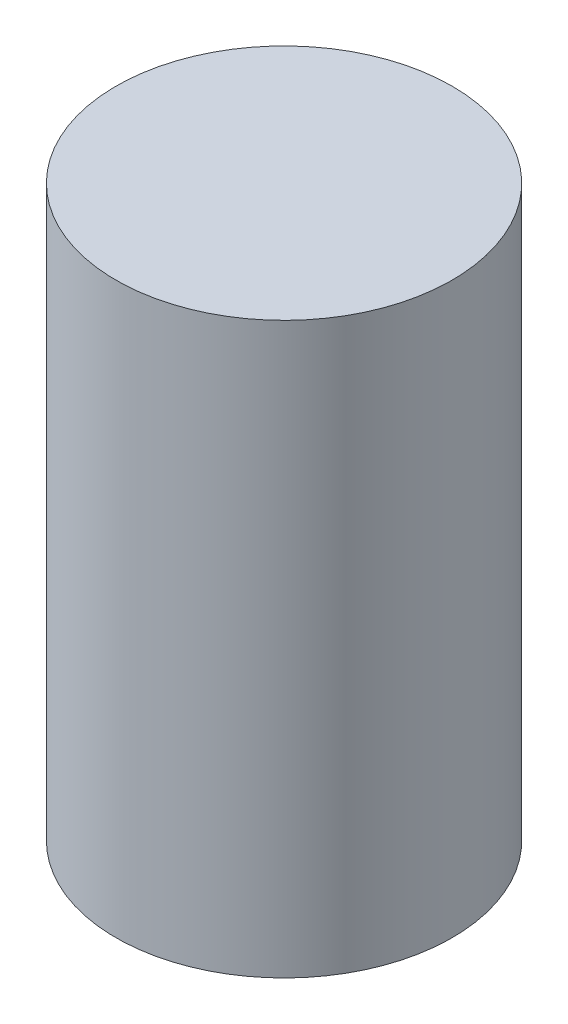
ISO-10303-21;
HEADER;
FILE_DESCRIPTION(('STEP AP214'),'2;1');
FILE_NAME('part.step','',(''),(''),'','','');
FILE_SCHEMA(('AUTOMOTIVE_DESIGN { 1 0 10303 214 1 1 1 1 }'));
ENDSEC;
DATA;
#1=APPLICATION_CONTEXT('core data for automotive mechanical design processes');
#2=APPLICATION_PROTOCOL_DEFINITION('international standard','automotive_design',2000,#1);
#3=PRODUCT_CONTEXT('',#1,'mechanical');
#4=PRODUCT('Part','Part','',(#3));
#5=PRODUCT_RELATED_PRODUCT_CATEGORY('part','',(#4));
#6=PRODUCT_DEFINITION_FORMATION('','',#4);
#7=PRODUCT_DEFINITION_CONTEXT('part definition',#1,'design');
#8=PRODUCT_DEFINITION('design','',#6,#7);
#9=PRODUCT_DEFINITION_SHAPE('','',#8);
#10=(LENGTH_UNIT() NAMED_UNIT(*) SI_UNIT(.MILLI.,.METRE.));
#11=(NAMED_UNIT(*) PLANE_ANGLE_UNIT() SI_UNIT($,.RADIAN.));
#12=(NAMED_UNIT(*) SI_UNIT($,.STERADIAN.) SOLID_ANGLE_UNIT());
#13=UNCERTAINTY_MEASURE_WITH_UNIT(LENGTH_MEASURE(1.E-05),#10,'distance_accuracy_value','');
#14=(GEOMETRIC_REPRESENTATION_CONTEXT(3) GLOBAL_UNCERTAINTY_ASSIGNED_CONTEXT((#13)) GLOBAL_UNIT_ASSIGNED_CONTEXT((#10,
#11,#12)) REPRESENTATION_CONTEXT('',''));
#15=CARTESIAN_POINT('',(0.,0.,0.));
#16=DIRECTION('',(0.,0.,1.));
#17=DIRECTION('',(1.,0.,0.));
#18=AXIS2_PLACEMENT_3D('',#15,#16,#17);
#19=CARTESIAN_POINT('',(0.,0.,0.));
#20=DIRECTION('',(0.,1.,0.));
#21=DIRECTION('',(0.,0.,1.));
#22=AXIS2_PLACEMENT_3D('',#19,#20,#21);
#23=PLANE('',#22);
#24=CARTESIAN_POINT('',(0.,0.,0.));
#25=DIRECTION('',(0.,1.,0.));
#26=DIRECTION('',(0.,0.,1.));
#27=AXIS2_PLACEMENT_3D('',#24,#25,#26);
#28=CIRCLE('',#27,540.);
#29=CARTESIAN_POINT('',(0.,-2.22044604925031E-13,-540.));
#30=VERTEX_POINT('',#29);
#31=EDGE_CURVE('E44',#30,#30,#28,.T.);
#32=ORIENTED_EDGE('',*,*,#31,.F.);
#33=EDGE_LOOP('',(#32));
#34=FACE_BOUND('',#33,.T.);
#35=CARTESIAN_POINT('',(0.,0.,0.));
#36=DIRECTION('',(0.,1.,0.));
#37=DIRECTION('',(0.,0.,1.));
#38=AXIS2_PLACEMENT_3D('',#35,#36,#37);
#39=CIRCLE('',#38,21.15);
#40=CARTESIAN_POINT('',(0.,0.,21.15));
#41=VERTEX_POINT('',#40);
#42=EDGE_CURVE('E10',#41,#41,#39,.F.);
#43=ORIENTED_EDGE('',*,*,#42,.F.);
#44=EDGE_LOOP('',(#43));
#45=FACE_BOUND('',#44,.T.);
#46=ADVANCED_FACE('F33',(#34,#45),#23,.F.);
#47=CARTESIAN_POINT('',(0.,1830.,0.));
#48=DIRECTION('',(0.,-1.,0.));
#49=DIRECTION('',(0.,0.,-1.));
#50=AXIS2_PLACEMENT_3D('',#47,#48,#49);
#51=CYLINDRICAL_SURFACE('',#50,540.);
#52=CARTESIAN_POINT('',(0.,1830.,0.));
#53=DIRECTION('',(0.,1.,0.));
#54=DIRECTION('',(0.,0.,1.));
#55=AXIS2_PLACEMENT_3D('',#52,#53,#54);
#56=CIRCLE('',#55,540.);
#57=CARTESIAN_POINT('',(0.,1830.,-540.));
#58=VERTEX_POINT('',#57);
#59=EDGE_CURVE('E40',#58,#58,#56,.T.);
#60=CARTESIAN_POINT('',(0.,1830.,-540.));
#61=CARTESIAN_POINT('',(0.,1810.9375,-540.));
#62=CARTESIAN_POINT('',(0.,1791.875,-540.));
#63=CARTESIAN_POINT('',(0.,1753.75,-540.));
#64=CARTESIAN_POINT('',(0.,1734.6875,-540.));
#65=CARTESIAN_POINT('',(0.,1696.5625,-540.));
#66=CARTESIAN_POINT('',(0.,1677.5,-540.));
#67=CARTESIAN_POINT('',(0.,1639.375,-540.));
#68=CARTESIAN_POINT('',(0.,1620.3125,-540.));
#69=CARTESIAN_POINT('',(0.,1582.1875,-540.));
#70=CARTESIAN_POINT('',(0.,1563.125,-540.));
#71=CARTESIAN_POINT('',(0.,1525.,-540.));
#72=CARTESIAN_POINT('',(0.,1505.9375,-540.));
#73=CARTESIAN_POINT('',(0.,1467.8125,-540.));
#74=CARTESIAN_POINT('',(0.,1448.75,-540.));
#75=CARTESIAN_POINT('',(0.,1410.625,-540.));
#76=CARTESIAN_POINT('',(0.,1391.5625,-540.));
#77=CARTESIAN_POINT('',(0.,1353.4375,-540.));
#78=CARTESIAN_POINT('',(0.,1334.375,-540.));
#79=CARTESIAN_POINT('',(0.,1296.25,-540.));
#80=CARTESIAN_POINT('',(0.,1277.1875,-540.));
#81=CARTESIAN_POINT('',(0.,1239.0625,-540.));
#82=CARTESIAN_POINT('',(0.,1220.,-540.));
#83=CARTESIAN_POINT('',(0.,1181.875,-540.));
#84=CARTESIAN_POINT('',(0.,1162.8125,-540.));
#85=CARTESIAN_POINT('',(0.,1124.6875,-540.));
#86=CARTESIAN_POINT('',(0.,1105.625,-540.));
#87=CARTESIAN_POINT('',(0.,1067.5,-540.));
#88=CARTESIAN_POINT('',(0.,1048.4375,-540.));
#89=CARTESIAN_POINT('',(0.,1010.3125,-540.));
#90=CARTESIAN_POINT('',(0.,991.25,-540.));
#91=CARTESIAN_POINT('',(0.,953.125,-540.));
#92=CARTESIAN_POINT('',(0.,934.0625,-540.));
#93=CARTESIAN_POINT('',(0.,895.9375,-540.));
#94=CARTESIAN_POINT('',(0.,876.875,-540.));
#95=CARTESIAN_POINT('',(0.,838.75,-540.));
#96=CARTESIAN_POINT('',(0.,819.6875,-540.));
#97=CARTESIAN_POINT('',(0.,781.5625,-540.));
#98=CARTESIAN_POINT('',(0.,762.5,-540.));
#99=CARTESIAN_POINT('',(0.,724.375,-540.));
#100=CARTESIAN_POINT('',(0.,705.3125,-540.));
#101=CARTESIAN_POINT('',(0.,667.1875,-540.));
#102=CARTESIAN_POINT('',(0.,648.125,-540.));
#103=CARTESIAN_POINT('',(0.,610.,-540.));
#104=CARTESIAN_POINT('',(0.,590.9375,-540.));
#105=CARTESIAN_POINT('',(0.,552.8125,-540.));
#106=CARTESIAN_POINT('',(0.,533.75,-540.));
#107=CARTESIAN_POINT('',(0.,495.625,-540.));
#108=CARTESIAN_POINT('',(0.,476.5625,-540.));
#109=CARTESIAN_POINT('',(0.,438.4375,-540.));
#110=CARTESIAN_POINT('',(0.,419.375,-540.));
#111=CARTESIAN_POINT('',(0.,381.25,-540.));
#112=CARTESIAN_POINT('',(0.,362.1875,-540.));
#113=CARTESIAN_POINT('',(0.,324.0625,-540.));
#114=CARTESIAN_POINT('',(0.,305.,-540.));
#115=CARTESIAN_POINT('',(0.,266.875,-540.));
#116=CARTESIAN_POINT('',(0.,247.8125,-540.));
#117=CARTESIAN_POINT('',(0.,209.6875,-540.));
#118=CARTESIAN_POINT('',(0.,190.625,-540.));
#119=CARTESIAN_POINT('',(0.,152.5,-540.));
#120=CARTESIAN_POINT('',(0.,133.4375,-540.));
#121=CARTESIAN_POINT('',(0.,95.3124999999998,-540.));
#122=CARTESIAN_POINT('',(0.,76.2499999999998,-540.));
#123=CARTESIAN_POINT('',(0.,38.1249999999997,-540.));
#124=CARTESIAN_POINT('',(0.,19.0624999999997,-540.));
#125=CARTESIAN_POINT('',(0.,-2.22044604925031E-13,-540.));
#126=B_SPLINE_CURVE_WITH_KNOTS('',3,(#60,#61,#62,#63,#64,#65,#66,#67,#68,#69,#70,#71,#72,#73,
#74,#75,#76,#77,#78,#79,#80,#81,#82,#83,#84,#85,#86,#87,#88,#89,#90,#91,#92,#93,#94,#95,#96,#97,
#98,#99,#100,#101,#102,#103,#104,#105,#106,#107,#108,#109,#110,#111,#112,#113,#114,#115,#116,
#117,#118,#119,#120,#121,#122,#123,#124,#125),.UNSPECIFIED.,.F.,.F.,(4,2,2,2,2,2,2,2,2,2,2,2,2,
2,2,2,2,2,2,2,2,2,2,2,2,2,2,2,2,2,2,2,4),(0.,57.1874999999999,114.375,171.5625,228.75,285.9375,
343.125,400.3125,457.5,514.6875,571.875,629.0625,686.25,743.4375,800.625,857.8125,915.,972.1875,
1029.375,1086.5625,1143.75,1200.9375,1258.125,1315.3125,1372.5,1429.6875,1486.875,1544.0625,
1601.25,1658.4375,1715.625,1772.8125,1830.),.UNSPECIFIED.);
#127=EDGE_CURVE('BSEAM35',#58,#30,#126,.T.);
#128=ORIENTED_EDGE('',*,*,#59,.F.);
#129=ORIENTED_EDGE('',*,*,#31,.T.);
#130=ORIENTED_EDGE('',*,*,#127,.T.);
#131=ORIENTED_EDGE('',*,*,#127,.F.);
#132=EDGE_LOOP('',(#128,#130,#129,#131));
#133=FACE_BOUND('',#132,.T.);
#134=ADVANCED_FACE('F35',(#133),#51,.T.);
#135=CARTESIAN_POINT('',(0.,1830.,0.));
#136=DIRECTION('',(0.,1.,0.));
#137=DIRECTION('',(0.,0.,1.));
#138=AXIS2_PLACEMENT_3D('',#135,#136,#137);
#139=PLANE('',#138);
#140=ORIENTED_EDGE('',*,*,#59,.T.);
#141=EDGE_LOOP('',(#140));
#142=FACE_BOUND('',#141,.T.);
#143=ADVANCED_FACE('F58',(#142),#139,.T.);
#144=CARTESIAN_POINT('',(0.,-30.,0.));
#145=DIRECTION('',(0.,1.,0.));
#146=DIRECTION('',(0.,0.,1.));
#147=AXIS2_PLACEMENT_3D('',#144,#145,#146);
#148=CYLINDRICAL_SURFACE('',#147,21.15);
#149=CARTESIAN_POINT('',(0.,-30.,0.));
#150=DIRECTION('',(0.,-1.,0.));
#151=DIRECTION('',(0.,0.,-1.));
#152=AXIS2_PLACEMENT_3D('',#149,#150,#151);
#153=CIRCLE('',#152,21.15);
#154=CARTESIAN_POINT('',(0.,-30.,-21.15));
#155=VERTEX_POINT('',#154);
#156=EDGE_CURVE('E49',#155,#155,#153,.T.);
#157=ORIENTED_EDGE('',*,*,#156,.F.);
#158=EDGE_LOOP('',(#157));
#159=FACE_BOUND('',#158,.T.);
#160=ORIENTED_EDGE('',*,*,#42,.T.);
#161=EDGE_LOOP('',(#160));
#162=FACE_BOUND('',#161,.T.);
#163=ADVANCED_FACE('F56',(#159,#162),#148,.T.);
#164=CARTESIAN_POINT('',(0.,-30.,0.));
#165=DIRECTION('',(0.,-1.,0.));
#166=DIRECTION('',(0.,0.,-1.));
#167=AXIS2_PLACEMENT_3D('',#164,#165,#166);
#168=PLANE('',#167);
#169=ORIENTED_EDGE('',*,*,#156,.T.);
#170=EDGE_LOOP('',(#169));
#171=FACE_BOUND('',#170,.T.);
#172=ADVANCED_FACE('F54',(#171),#168,.T.);
#173=CLOSED_SHELL('',(#46,#134,#143,#163,#172));
#174=MANIFOLD_SOLID_BREP('B2',#173);
#175=ADVANCED_BREP_SHAPE_REPRESENTATION('',(#18,#174),#14);
#176=SHAPE_DEFINITION_REPRESENTATION(#9,#175);
ENDSEC;
END-ISO-10303-21;
